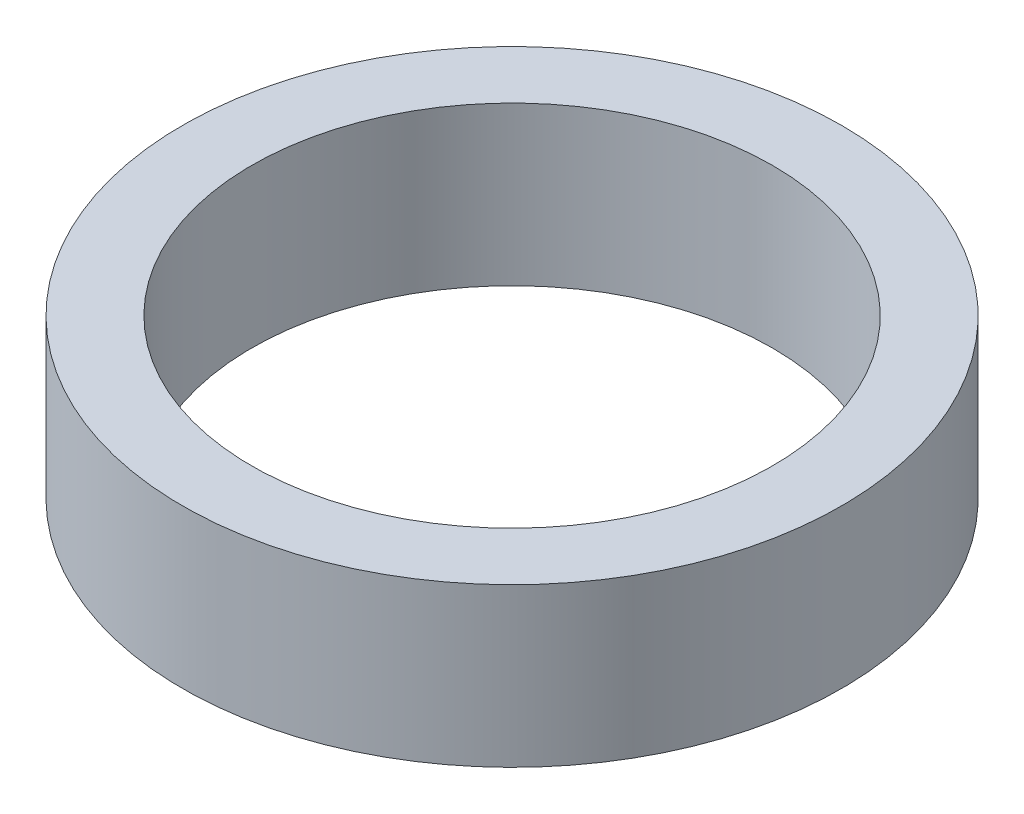
ISO-10303-21;
HEADER;
FILE_DESCRIPTION(('STEP AP214'),'2;1');
FILE_NAME('part.step','',(''),(''),'','','');
FILE_SCHEMA(('AUTOMOTIVE_DESIGN { 1 0 10303 214 1 1 1 1 }'));
ENDSEC;
DATA;
#1=APPLICATION_CONTEXT('core data for automotive mechanical design processes');
#2=APPLICATION_PROTOCOL_DEFINITION('international standard','automotive_design',2000,#1);
#3=PRODUCT_CONTEXT('',#1,'mechanical');
#4=PRODUCT('Part','Part','',(#3));
#5=PRODUCT_RELATED_PRODUCT_CATEGORY('part','',(#4));
#6=PRODUCT_DEFINITION_FORMATION('','',#4);
#7=PRODUCT_DEFINITION_CONTEXT('part definition',#1,'design');
#8=PRODUCT_DEFINITION('design','',#6,#7);
#9=PRODUCT_DEFINITION_SHAPE('','',#8);
#10=(LENGTH_UNIT() NAMED_UNIT(*) SI_UNIT(.MILLI.,.METRE.));
#11=(NAMED_UNIT(*) PLANE_ANGLE_UNIT() SI_UNIT($,.RADIAN.));
#12=(NAMED_UNIT(*) SI_UNIT($,.STERADIAN.) SOLID_ANGLE_UNIT());
#13=UNCERTAINTY_MEASURE_WITH_UNIT(LENGTH_MEASURE(1.E-05),#10,'distance_accuracy_value','');
#14=(GEOMETRIC_REPRESENTATION_CONTEXT(3) GLOBAL_UNCERTAINTY_ASSIGNED_CONTEXT((#13)) GLOBAL_UNIT_ASSIGNED_CONTEXT((#10,
#11,#12)) REPRESENTATION_CONTEXT('',''));
#15=CARTESIAN_POINT('',(0.,0.,0.));
#16=DIRECTION('',(0.,0.,1.));
#17=DIRECTION('',(1.,0.,0.));
#18=AXIS2_PLACEMENT_3D('',#15,#16,#17);
#19=CARTESIAN_POINT('',(0.,1.524,0.));
#20=DIRECTION('',(0.,1.,0.));
#21=DIRECTION('',(0.,0.,1.));
#22=AXIS2_PLACEMENT_3D('',#19,#20,#21);
#23=PLANE('',#22);
#24=CARTESIAN_POINT('',(0.,1.524,0.));
#25=DIRECTION('',(0.,1.,0.));
#26=DIRECTION('',(0.,0.,1.));
#27=AXIS2_PLACEMENT_3D('',#24,#25,#26);
#28=CIRCLE('',#27,3.175);
#29=CARTESIAN_POINT('',(0.,1.524,-3.175));
#30=VERTEX_POINT('',#29);
#31=EDGE_CURVE('E10',#30,#30,#28,.T.);
#32=ORIENTED_EDGE('',*,*,#31,.T.);
#33=EDGE_LOOP('',(#32));
#34=FACE_BOUND('',#33,.T.);
#35=CARTESIAN_POINT('',(0.,1.524,0.));
#36=DIRECTION('',(0.,1.,0.));
#37=DIRECTION('',(0.,0.,1.));
#38=AXIS2_PLACEMENT_3D('',#35,#36,#37);
#39=CIRCLE('',#38,2.50825);
#40=CARTESIAN_POINT('',(0.,1.524,-2.50825));
#41=VERTEX_POINT('',#40);
#42=EDGE_CURVE('E42',#41,#41,#39,.T.);
#43=ORIENTED_EDGE('',*,*,#42,.F.);
#44=EDGE_LOOP('',(#43));
#45=FACE_BOUND('',#44,.T.);
#46=ADVANCED_FACE('F31',(#34,#45),#23,.T.);
#47=CARTESIAN_POINT('',(0.,0.,0.));
#48=DIRECTION('',(0.,1.,0.));
#49=DIRECTION('',(0.,0.,1.));
#50=AXIS2_PLACEMENT_3D('',#47,#48,#49);
#51=PLANE('',#50);
#52=CARTESIAN_POINT('',(0.,0.,0.));
#53=DIRECTION('',(0.,1.,0.));
#54=DIRECTION('',(0.,0.,1.));
#55=AXIS2_PLACEMENT_3D('',#52,#53,#54);
#56=CIRCLE('',#55,3.175);
#57=CARTESIAN_POINT('',(0.,0.,-3.175));
#58=VERTEX_POINT('',#57);
#59=EDGE_CURVE('E35',#58,#58,#56,.T.);
#60=ORIENTED_EDGE('',*,*,#59,.F.);
#61=EDGE_LOOP('',(#60));
#62=FACE_BOUND('',#61,.T.);
#63=CARTESIAN_POINT('',(0.,0.,0.));
#64=DIRECTION('',(0.,1.,0.));
#65=DIRECTION('',(0.,0.,1.));
#66=AXIS2_PLACEMENT_3D('',#63,#64,#65);
#67=CIRCLE('',#66,2.50825);
#68=CARTESIAN_POINT('',(0.,0.,-2.50825));
#69=VERTEX_POINT('',#68);
#70=EDGE_CURVE('E44',#69,#69,#67,.T.);
#71=ORIENTED_EDGE('',*,*,#70,.T.);
#72=EDGE_LOOP('',(#71));
#73=FACE_BOUND('',#72,.T.);
#74=ADVANCED_FACE('F54',(#62,#73),#51,.F.);
#75=CARTESIAN_POINT('',(0.,1.524,0.));
#76=DIRECTION('',(0.,-1.,0.));
#77=DIRECTION('',(0.,0.,-1.));
#78=AXIS2_PLACEMENT_3D('',#75,#76,#77);
#79=CYLINDRICAL_SURFACE('',#78,3.175);
#80=CARTESIAN_POINT('',(0.,1.524,-3.175));
#81=CARTESIAN_POINT('',(0.,1.508125,-3.175));
#82=CARTESIAN_POINT('',(0.,1.49225,-3.175));
#83=CARTESIAN_POINT('',(0.,1.4605,-3.175));
#84=CARTESIAN_POINT('',(0.,1.444625,-3.175));
#85=CARTESIAN_POINT('',(0.,1.412875,-3.175));
#86=CARTESIAN_POINT('',(0.,1.397,-3.175));
#87=CARTESIAN_POINT('',(0.,1.36525,-3.175));
#88=CARTESIAN_POINT('',(0.,1.349375,-3.175));
#89=CARTESIAN_POINT('',(0.,1.317625,-3.175));
#90=CARTESIAN_POINT('',(0.,1.30175,-3.175));
#91=CARTESIAN_POINT('',(0.,1.27,-3.175));
#92=CARTESIAN_POINT('',(0.,1.254125,-3.175));
#93=CARTESIAN_POINT('',(0.,1.222375,-3.175));
#94=CARTESIAN_POINT('',(0.,1.2065,-3.175));
#95=CARTESIAN_POINT('',(0.,1.17475,-3.175));
#96=CARTESIAN_POINT('',(0.,1.158875,-3.175));
#97=CARTESIAN_POINT('',(0.,1.127125,-3.175));
#98=CARTESIAN_POINT('',(0.,1.11125,-3.175));
#99=CARTESIAN_POINT('',(0.,1.0795,-3.175));
#100=CARTESIAN_POINT('',(0.,1.063625,-3.175));
#101=CARTESIAN_POINT('',(0.,1.031875,-3.175));
#102=CARTESIAN_POINT('',(0.,1.016,-3.175));
#103=CARTESIAN_POINT('',(0.,0.98425,-3.175));
#104=CARTESIAN_POINT('',(0.,0.968375,-3.175));
#105=CARTESIAN_POINT('',(0.,0.936625,-3.175));
#106=CARTESIAN_POINT('',(0.,0.92075,-3.175));
#107=CARTESIAN_POINT('',(0.,0.889,-3.175));
#108=CARTESIAN_POINT('',(0.,0.873125,-3.175));
#109=CARTESIAN_POINT('',(0.,0.841375,-3.175));
#110=CARTESIAN_POINT('',(0.,0.8255,-3.175));
#111=CARTESIAN_POINT('',(0.,0.79375,-3.175));
#112=CARTESIAN_POINT('',(0.,0.777875,-3.175));
#113=CARTESIAN_POINT('',(0.,0.746125,-3.175));
#114=CARTESIAN_POINT('',(0.,0.73025,-3.175));
#115=CARTESIAN_POINT('',(0.,0.6985,-3.175));
#116=CARTESIAN_POINT('',(0.,0.682625,-3.175));
#117=CARTESIAN_POINT('',(0.,0.650875,-3.175));
#118=CARTESIAN_POINT('',(0.,0.635,-3.175));
#119=CARTESIAN_POINT('',(0.,0.60325,-3.175));
#120=CARTESIAN_POINT('',(0.,0.587375,-3.175));
#121=CARTESIAN_POINT('',(0.,0.555625,-3.175));
#122=CARTESIAN_POINT('',(0.,0.53975,-3.175));
#123=CARTESIAN_POINT('',(0.,0.508,-3.175));
#124=CARTESIAN_POINT('',(0.,0.492125,-3.175));
#125=CARTESIAN_POINT('',(0.,0.460375,-3.175));
#126=CARTESIAN_POINT('',(0.,0.4445,-3.175));
#127=CARTESIAN_POINT('',(0.,0.41275,-3.175));
#128=CARTESIAN_POINT('',(0.,0.396875,-3.175));
#129=CARTESIAN_POINT('',(0.,0.365125,-3.175));
#130=CARTESIAN_POINT('',(0.,0.34925,-3.175));
#131=CARTESIAN_POINT('',(0.,0.3175,-3.175));
#132=CARTESIAN_POINT('',(0.,0.301625,-3.175));
#133=CARTESIAN_POINT('',(0.,0.269875,-3.175));
#134=CARTESIAN_POINT('',(0.,0.254,-3.175));
#135=CARTESIAN_POINT('',(0.,0.22225,-3.175));
#136=CARTESIAN_POINT('',(0.,0.206375,-3.175));
#137=CARTESIAN_POINT('',(0.,0.174625,-3.175));
#138=CARTESIAN_POINT('',(0.,0.15875,-3.175));
#139=CARTESIAN_POINT('',(0.,0.127,-3.175));
#140=CARTESIAN_POINT('',(0.,0.111125,-3.175));
#141=CARTESIAN_POINT('',(0.,0.079375,-3.175));
#142=CARTESIAN_POINT('',(0.,0.0635,-3.175));
#143=CARTESIAN_POINT('',(0.,0.0317499999999999,-3.175));
#144=CARTESIAN_POINT('',(0.,0.015875,-3.175));
#145=CARTESIAN_POINT('',(0.,0.,-3.175));
#146=B_SPLINE_CURVE_WITH_KNOTS('',3,(#80,#81,#82,#83,#84,#85,#86,#87,#88,#89,#90,#91,#92,#93,
#94,#95,#96,#97,#98,#99,#100,#101,#102,#103,#104,#105,#106,#107,#108,#109,#110,#111,#112,#113,
#114,#115,#116,#117,#118,#119,#120,#121,#122,#123,#124,#125,#126,#127,#128,#129,#130,#131,#132,
#133,#134,#135,#136,#137,#138,#139,#140,#141,#142,#143,#144,#145),.UNSPECIFIED.,.F.,.F.,(4,2,2,
2,2,2,2,2,2,2,2,2,2,2,2,2,2,2,2,2,2,2,2,2,2,2,2,2,2,2,2,2,4),(0.,0.0476250000000001,
0.0952500000000001,0.142875,0.1905,0.238125,0.28575,0.333375,0.381,0.428625,0.47625,0.523875,
0.5715,0.619125,0.66675,0.714375,0.762,0.809625,0.85725,0.904875,0.9525,1.000125,1.04775,
1.095375,1.143,1.190625,1.23825,1.285875,1.3335,1.381125,1.42875,1.476375,1.524),.UNSPECIFIED.);
#147=EDGE_CURVE('BSEAM33',#30,#58,#146,.T.);
#148=ORIENTED_EDGE('',*,*,#31,.F.);
#149=ORIENTED_EDGE('',*,*,#59,.T.);
#150=ORIENTED_EDGE('',*,*,#147,.T.);
#151=ORIENTED_EDGE('',*,*,#147,.F.);
#152=EDGE_LOOP('',(#148,#150,#149,#151));
#153=FACE_BOUND('',#152,.T.);
#154=ADVANCED_FACE('F33',(#153),#79,.T.);
#155=CARTESIAN_POINT('',(0.,1.524,0.));
#156=DIRECTION('',(0.,-1.,0.));
#157=DIRECTION('',(0.,0.,-1.));
#158=AXIS2_PLACEMENT_3D('',#155,#156,#157);
#159=CYLINDRICAL_SURFACE('',#158,2.50825);
#160=CARTESIAN_POINT('',(0.,1.524,-2.50825));
#161=CARTESIAN_POINT('',(0.,1.508125,-2.50825));
#162=CARTESIAN_POINT('',(0.,1.49225,-2.50825));
#163=CARTESIAN_POINT('',(0.,1.4605,-2.50825));
#164=CARTESIAN_POINT('',(0.,1.444625,-2.50825));
#165=CARTESIAN_POINT('',(0.,1.412875,-2.50825));
#166=CARTESIAN_POINT('',(0.,1.397,-2.50825));
#167=CARTESIAN_POINT('',(0.,1.36525,-2.50825));
#168=CARTESIAN_POINT('',(0.,1.349375,-2.50825));
#169=CARTESIAN_POINT('',(0.,1.317625,-2.50825));
#170=CARTESIAN_POINT('',(0.,1.30175,-2.50825));
#171=CARTESIAN_POINT('',(0.,1.27,-2.50825));
#172=CARTESIAN_POINT('',(0.,1.254125,-2.50825));
#173=CARTESIAN_POINT('',(0.,1.222375,-2.50825));
#174=CARTESIAN_POINT('',(0.,1.2065,-2.50825));
#175=CARTESIAN_POINT('',(0.,1.17475,-2.50825));
#176=CARTESIAN_POINT('',(0.,1.158875,-2.50825));
#177=CARTESIAN_POINT('',(0.,1.127125,-2.50825));
#178=CARTESIAN_POINT('',(0.,1.11125,-2.50825));
#179=CARTESIAN_POINT('',(0.,1.0795,-2.50825));
#180=CARTESIAN_POINT('',(0.,1.063625,-2.50825));
#181=CARTESIAN_POINT('',(0.,1.031875,-2.50825));
#182=CARTESIAN_POINT('',(0.,1.016,-2.50825));
#183=CARTESIAN_POINT('',(0.,0.98425,-2.50825));
#184=CARTESIAN_POINT('',(0.,0.968375,-2.50825));
#185=CARTESIAN_POINT('',(0.,0.936625,-2.50825));
#186=CARTESIAN_POINT('',(0.,0.92075,-2.50825));
#187=CARTESIAN_POINT('',(0.,0.889,-2.50825));
#188=CARTESIAN_POINT('',(0.,0.873125,-2.50825));
#189=CARTESIAN_POINT('',(0.,0.841375,-2.50825));
#190=CARTESIAN_POINT('',(0.,0.8255,-2.50825));
#191=CARTESIAN_POINT('',(0.,0.79375,-2.50825));
#192=CARTESIAN_POINT('',(0.,0.777875,-2.50825));
#193=CARTESIAN_POINT('',(0.,0.746125,-2.50825));
#194=CARTESIAN_POINT('',(0.,0.73025,-2.50825));
#195=CARTESIAN_POINT('',(0.,0.6985,-2.50825));
#196=CARTESIAN_POINT('',(0.,0.682625,-2.50825));
#197=CARTESIAN_POINT('',(0.,0.650875,-2.50825));
#198=CARTESIAN_POINT('',(0.,0.635,-2.50825));
#199=CARTESIAN_POINT('',(0.,0.60325,-2.50825));
#200=CARTESIAN_POINT('',(0.,0.587375,-2.50825));
#201=CARTESIAN_POINT('',(0.,0.555625,-2.50825));
#202=CARTESIAN_POINT('',(0.,0.53975,-2.50825));
#203=CARTESIAN_POINT('',(0.,0.508,-2.50825));
#204=CARTESIAN_POINT('',(0.,0.492125,-2.50825));
#205=CARTESIAN_POINT('',(0.,0.460375,-2.50825));
#206=CARTESIAN_POINT('',(0.,0.4445,-2.50825));
#207=CARTESIAN_POINT('',(0.,0.41275,-2.50825));
#208=CARTESIAN_POINT('',(0.,0.396875,-2.50825));
#209=CARTESIAN_POINT('',(0.,0.365125,-2.50825));
#210=CARTESIAN_POINT('',(0.,0.34925,-2.50825));
#211=CARTESIAN_POINT('',(0.,0.3175,-2.50825));
#212=CARTESIAN_POINT('',(0.,0.301625,-2.50825));
#213=CARTESIAN_POINT('',(0.,0.269875,-2.50825));
#214=CARTESIAN_POINT('',(0.,0.254,-2.50825));
#215=CARTESIAN_POINT('',(0.,0.22225,-2.50825));
#216=CARTESIAN_POINT('',(0.,0.206375,-2.50825));
#217=CARTESIAN_POINT('',(0.,0.174625,-2.50825));
#218=CARTESIAN_POINT('',(0.,0.15875,-2.50825));
#219=CARTESIAN_POINT('',(0.,0.127,-2.50825));
#220=CARTESIAN_POINT('',(0.,0.111125,-2.50825));
#221=CARTESIAN_POINT('',(0.,0.079375,-2.50825));
#222=CARTESIAN_POINT('',(0.,0.0635,-2.50825));
#223=CARTESIAN_POINT('',(0.,0.0317499999999999,-2.50825));
#224=CARTESIAN_POINT('',(0.,0.015875,-2.50825));
#225=CARTESIAN_POINT('',(0.,0.,-2.50825));
#226=B_SPLINE_CURVE_WITH_KNOTS('',3,(#160,#161,#162,#163,#164,#165,#166,#167,#168,#169,#170,
#171,#172,#173,#174,#175,#176,#177,#178,#179,#180,#181,#182,#183,#184,#185,#186,#187,#188,#189,
#190,#191,#192,#193,#194,#195,#196,#197,#198,#199,#200,#201,#202,#203,#204,#205,#206,#207,#208,
#209,#210,#211,#212,#213,#214,#215,#216,#217,#218,#219,#220,#221,#222,#223,#224,#225),
.UNSPECIFIED.,.F.,.F.,(4,2,2,2,2,2,2,2,2,2,2,2,2,2,2,2,2,2,2,2,2,2,2,2,2,2,2,2,2,2,2,2,4),(0.,
0.0476250000000001,0.0952500000000001,0.142875,0.1905,0.238125,0.28575,0.333375,0.381,0.428625,
0.47625,0.523875,0.5715,0.619125,0.66675,0.714375,0.762,0.809625,0.85725,0.904875,0.9525,
1.000125,1.04775,1.095375,1.143,1.190625,1.23825,1.285875,1.3335,1.381125,1.42875,1.476375,
1.524),.UNSPECIFIED.);
#227=EDGE_CURVE('BSEAM50',#41,#69,#226,.T.);
#228=ORIENTED_EDGE('',*,*,#42,.T.);
#229=ORIENTED_EDGE('',*,*,#70,.F.);
#230=ORIENTED_EDGE('',*,*,#227,.T.);
#231=ORIENTED_EDGE('',*,*,#227,.F.);
#232=EDGE_LOOP('',(#228,#230,#229,#231));
#233=FACE_BOUND('',#232,.T.);
#234=ADVANCED_FACE('F50',(#233),#159,.F.);
#235=CLOSED_SHELL('',(#46,#74,#154,#234));
#236=MANIFOLD_SOLID_BREP('B2',#235);
#237=ADVANCED_BREP_SHAPE_REPRESENTATION('',(#18,#236),#14);
#238=SHAPE_DEFINITION_REPRESENTATION(#9,#237);
ENDSEC;
END-ISO-10303-21;
